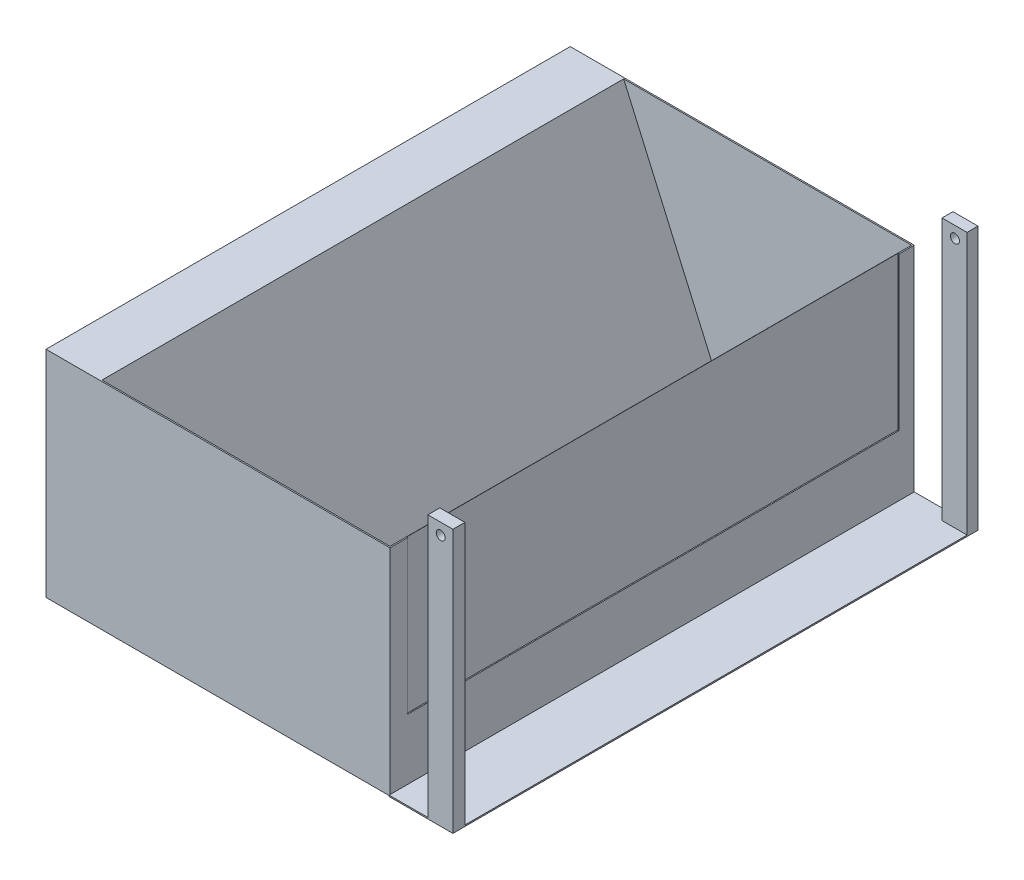
ISO-10303-21;
HEADER;
FILE_DESCRIPTION(('STEP AP214'),'2;1');
FILE_NAME('part.step','',(''),(''),'','','');
FILE_SCHEMA(('AUTOMOTIVE_DESIGN { 1 0 10303 214 1 1 1 1 }'));
ENDSEC;
DATA;
#1=APPLICATION_CONTEXT('core data for automotive mechanical design processes');
#2=APPLICATION_PROTOCOL_DEFINITION('international standard','automotive_design',2000,#1);
#3=PRODUCT_CONTEXT('',#1,'mechanical');
#4=PRODUCT('Part','Part','',(#3));
#5=PRODUCT_RELATED_PRODUCT_CATEGORY('part','',(#4));
#6=PRODUCT_DEFINITION_FORMATION('','',#4);
#7=PRODUCT_DEFINITION_CONTEXT('part definition',#1,'design');
#8=PRODUCT_DEFINITION('design','',#6,#7);
#9=PRODUCT_DEFINITION_SHAPE('','',#8);
#10=(LENGTH_UNIT() NAMED_UNIT(*) SI_UNIT(.MILLI.,.METRE.));
#11=(NAMED_UNIT(*) PLANE_ANGLE_UNIT() SI_UNIT($,.RADIAN.));
#12=(NAMED_UNIT(*) SI_UNIT($,.STERADIAN.) SOLID_ANGLE_UNIT());
#13=UNCERTAINTY_MEASURE_WITH_UNIT(LENGTH_MEASURE(1.E-05),#10,'distance_accuracy_value','');
#14=(GEOMETRIC_REPRESENTATION_CONTEXT(3) GLOBAL_UNCERTAINTY_ASSIGNED_CONTEXT((#13)) GLOBAL_UNIT_ASSIGNED_CONTEXT((#10,
#11,#12)) REPRESENTATION_CONTEXT('',''));
#15=CARTESIAN_POINT('',(0.,0.,0.));
#16=DIRECTION('',(0.,0.,1.));
#17=DIRECTION('',(1.,0.,0.));
#18=AXIS2_PLACEMENT_3D('',#15,#16,#17);
#19=CARTESIAN_POINT('',(0.,3.00010033,0.));
#20=DIRECTION('',(0.,-1.,0.));
#21=DIRECTION('',(0.,0.,-1.));
#22=AXIS2_PLACEMENT_3D('',#19,#20,#21);
#23=PLANE('',#22);
#24=DIRECTION('',(-1.,0.,0.));
#25=VECTOR('',#24,1.);
#26=CARTESIAN_POINT('',(165.415258105816,3.00010033,0.));
#27=LINE('',#26,#25);
#28=CARTESIAN_POINT('',(165.415258105816,3.00010033,0.));
#29=VERTEX_POINT('',#28);
#30=CARTESIAN_POINT('',(107.186289926717,3.00010033,0.));
#31=VERTEX_POINT('',#30);
#32=EDGE_CURVE('E138',#29,#31,#27,.T.);
#33=ORIENTED_EDGE('',*,*,#32,.F.);
#34=DIRECTION('',(0.,0.,1.));
#35=VECTOR('',#34,1.);
#36=CARTESIAN_POINT('',(165.415258105816,3.00010033,-1193.38210272873));
#37=LINE('',#36,#35);
#38=CARTESIAN_POINT('',(165.415258105816,3.00010033,-1167.98210272873));
#39=VERTEX_POINT('',#38);
#40=EDGE_CURVE('E150',#39,#29,#37,.T.);
#41=ORIENTED_EDGE('',*,*,#40,.F.);
#42=DIRECTION('',(1.,0.,0.));
#43=VECTOR('',#42,1.);
#44=CARTESIAN_POINT('',(107.186289926717,3.00010033,-1167.98210272873));
#45=LINE('',#44,#43);
#46=CARTESIAN_POINT('',(107.186289926717,3.00010033,-1167.98210272873));
#47=VERTEX_POINT('',#46);
#48=EDGE_CURVE('E66',#47,#39,#45,.T.);
#49=ORIENTED_EDGE('',*,*,#48,.F.);
#50=DIRECTION('',(0.,0.,1.));
#51=VECTOR('',#50,1.);
#52=CARTESIAN_POINT('',(107.186289926717,3.00010033,-1193.38210272873));
#53=LINE('',#52,#51);
#54=CARTESIAN_POINT('',(107.186289926717,3.00010033,-1193.38210272873));
#55=VERTEX_POINT('',#54);
#56=EDGE_CURVE('E71',#55,#47,#53,.T.);
#57=ORIENTED_EDGE('',*,*,#56,.F.);
#58=DIRECTION('',(1.,0.,0.));
#59=VECTOR('',#58,1.);
#60=CARTESIAN_POINT('',(17.0836237800826,3.00010033,-1193.38210272873));
#61=LINE('',#60,#59);
#62=CARTESIAN_POINT('',(17.0836237800826,3.00010033,-1193.38210272873));
#63=VERTEX_POINT('',#62);
#64=EDGE_CURVE('E154',#63,#55,#61,.T.);
#65=ORIENTED_EDGE('',*,*,#64,.F.);
#66=DIRECTION('',(0.,0.,1.));
#67=VECTOR('',#66,1.);
#68=CARTESIAN_POINT('',(17.0836237800826,3.00010033,-1193.38210272873));
#69=LINE('',#68,#67);
#70=CARTESIAN_POINT('',(17.0836237800826,3.00010033,27.840540907166));
#71=VERTEX_POINT('',#70);
#72=EDGE_CURVE('E149',#63,#71,#69,.T.);
#73=ORIENTED_EDGE('',*,*,#72,.T.);
#74=DIRECTION('',(1.,0.,0.));
#75=VECTOR('',#74,1.);
#76=CARTESIAN_POINT('',(17.0836237800826,3.00010033,27.840540907166));
#77=LINE('',#76,#75);
#78=CARTESIAN_POINT('',(107.186289926717,3.00010033,27.840540907166));
#79=VERTEX_POINT('',#78);
#80=EDGE_CURVE('E143',#71,#79,#77,.T.);
#81=ORIENTED_EDGE('',*,*,#80,.T.);
#82=DIRECTION('',(0.,0.,1.));
#83=VECTOR('',#82,1.);
#84=CARTESIAN_POINT('',(107.186289926717,3.00010033,27.840540907166));
#85=LINE('',#84,#83);
#86=EDGE_CURVE('E128',#31,#79,#85,.T.);
#87=ORIENTED_EDGE('',*,*,#86,.F.);
#88=EDGE_LOOP('',(#33,#41,#49,#57,#65,#73,#81,#87));
#89=FACE_BOUND('',#88,.T.);
#90=ADVANCED_FACE('F49',(#89),#23,.F.);
#91=CARTESIAN_POINT('',(17.0836237800826,-0.0479999999999999,27.840540907166));
#92=DIRECTION('',(0.,0.,1.));
#93=DIRECTION('',(1.,0.,0.));
#94=AXIS2_PLACEMENT_3D('',#91,#92,#93);
#95=PLANE('',#94);
#96=CARTESIAN_POINT('',(137.096355471617,586.215569874302,27.840540907166));
#97=DIRECTION('',(0.,0.,1.));
#98=DIRECTION('',(1.,0.,0.));
#99=AXIS2_PLACEMENT_3D('',#96,#97,#98);
#100=CIRCLE('',#99,10.4501468390423);
#101=CARTESIAN_POINT('',(147.546502310659,586.215569874302,27.840540907166));
#102=VERTEX_POINT('',#101);
#103=EDGE_CURVE('E401',#102,#102,#100,.T.);
#104=ORIENTED_EDGE('',*,*,#103,.F.);
#105=EDGE_LOOP('',(#104));
#106=FACE_BOUND('',#105,.T.);
#107=DIRECTION('',(0.,1.,0.));
#108=VECTOR('',#107,1.);
#109=CARTESIAN_POINT('',(165.415258105816,-0.0479999999999999,27.840540907166));
#110=LINE('',#109,#108);
#111=CARTESIAN_POINT('',(165.415258105816,-0.0479999999999999,27.840540907166));
#112=VERTEX_POINT('',#111);
#113=CARTESIAN_POINT('',(165.415258105816,612.60010033,27.840540907166));
#114=VERTEX_POINT('',#113);
#115=EDGE_CURVE('E171',#112,#114,#110,.T.);
#116=ORIENTED_EDGE('',*,*,#115,.T.);
#117=DIRECTION('',(1.,0.,0.));
#118=VECTOR('',#117,1.);
#119=CARTESIAN_POINT('',(165.415258105816,612.60010033,27.840540907166));
#120=LINE('',#119,#118);
#121=CARTESIAN_POINT('',(107.186289926717,612.60010033,27.840540907166));
#122=VERTEX_POINT('',#121);
#123=EDGE_CURVE('E145',#122,#114,#120,.T.);
#124=ORIENTED_EDGE('',*,*,#123,.F.);
#125=DIRECTION('',(0.,-1.,0.));
#126=VECTOR('',#125,1.);
#127=CARTESIAN_POINT('',(107.186289926717,612.60010033,27.840540907166));
#128=LINE('',#127,#126);
#129=EDGE_CURVE('E132',#122,#79,#128,.T.);
#130=ORIENTED_EDGE('',*,*,#129,.T.);
#131=ORIENTED_EDGE('',*,*,#80,.F.);
#132=DIRECTION('',(0.,1.,0.));
#133=VECTOR('',#132,1.);
#134=CARTESIAN_POINT('',(17.0836237800826,-0.0479999999999999,27.840540907166));
#135=LINE('',#134,#133);
#136=CARTESIAN_POINT('',(17.0836237800826,-0.0479999999999999,27.840540907166));
#137=VERTEX_POINT('',#136);
#138=EDGE_CURVE('E12',#137,#71,#135,.T.);
#139=ORIENTED_EDGE('',*,*,#138,.F.);
#140=DIRECTION('',(1.,0.,0.));
#141=VECTOR('',#140,1.);
#142=CARTESIAN_POINT('',(17.0836237800826,-0.0479999999999999,27.840540907166));
#143=LINE('',#142,#141);
#144=EDGE_CURVE('E162',#137,#112,#143,.T.);
#145=ORIENTED_EDGE('',*,*,#144,.T.);
#146=EDGE_LOOP('',(#116,#124,#130,#131,#139,#145));
#147=FACE_BOUND('',#146,.T.);
#148=ADVANCED_FACE('F51',(#106,#147),#95,.T.);
#149=CARTESIAN_POINT('',(17.0836237800826,-0.0479999999999999,-1193.38210272873));
#150=DIRECTION('',(-1.,0.,0.));
#151=DIRECTION('',(0.,0.,1.));
#152=AXIS2_PLACEMENT_3D('',#149,#150,#151);
#153=PLANE('',#152);
#154=ORIENTED_EDGE('',*,*,#138,.T.);
#155=ORIENTED_EDGE('',*,*,#72,.F.);
#156=DIRECTION('',(0.,1.,0.));
#157=VECTOR('',#156,1.);
#158=CARTESIAN_POINT('',(17.0836237800826,-0.0479999999999999,-1193.38210272873));
#159=LINE('',#158,#157);
#160=CARTESIAN_POINT('',(17.0836237800826,-0.0479999999999999,-1193.38210272873));
#161=VERTEX_POINT('',#160);
#162=EDGE_CURVE('E58',#161,#63,#159,.T.);
#163=ORIENTED_EDGE('',*,*,#162,.F.);
#164=DIRECTION('',(0.,0.,1.));
#165=VECTOR('',#164,1.);
#166=CARTESIAN_POINT('',(17.0836237800826,-0.0479999999999999,-1193.38210272873));
#167=LINE('',#166,#165);
#168=EDGE_CURVE('E169',#161,#137,#167,.T.);
#169=ORIENTED_EDGE('',*,*,#168,.T.);
#170=EDGE_LOOP('',(#154,#155,#163,#169));
#171=FACE_BOUND('',#170,.T.);
#172=ADVANCED_FACE('F224',(#171),#153,.T.);
#173=CARTESIAN_POINT('',(17.0836237800826,-0.0479999999999999,-1193.38210272873));
#174=DIRECTION('',(0.,0.,1.));
#175=DIRECTION('',(1.,0.,0.));
#176=AXIS2_PLACEMENT_3D('',#173,#174,#175);
#177=PLANE('',#176);
#178=ORIENTED_EDGE('',*,*,#162,.T.);
#179=ORIENTED_EDGE('',*,*,#64,.T.);
#180=DIRECTION('',(0.,-1.,0.));
#181=VECTOR('',#180,1.);
#182=CARTESIAN_POINT('',(107.186289926717,612.60010033,-1193.38210272873));
#183=LINE('',#182,#181);
#184=CARTESIAN_POINT('',(107.186289926717,612.60010033,-1193.38210272873));
#185=VERTEX_POINT('',#184);
#186=EDGE_CURVE('E203',#185,#55,#183,.T.);
#187=ORIENTED_EDGE('',*,*,#186,.F.);
#188=DIRECTION('',(-1.,0.,0.));
#189=VECTOR('',#188,1.);
#190=CARTESIAN_POINT('',(107.186289926717,612.60010033,-1193.38210272873));
#191=LINE('',#190,#189);
#192=CARTESIAN_POINT('',(165.415258105816,612.60010033,-1193.38210272873));
#193=VERTEX_POINT('',#192);
#194=EDGE_CURVE('E201',#193,#185,#191,.T.);
#195=ORIENTED_EDGE('',*,*,#194,.F.);
#196=DIRECTION('',(0.,1.,0.));
#197=VECTOR('',#196,1.);
#198=CARTESIAN_POINT('',(165.415258105816,-0.0479999999999999,-1193.38210272873));
#199=LINE('',#198,#197);
#200=CARTESIAN_POINT('',(165.415258105816,-0.0479999999999999,-1193.38210272873));
#201=VERTEX_POINT('',#200);
#202=EDGE_CURVE('E174',#201,#193,#199,.T.);
#203=ORIENTED_EDGE('',*,*,#202,.F.);
#204=DIRECTION('',(1.,0.,0.));
#205=VECTOR('',#204,1.);
#206=CARTESIAN_POINT('',(17.0836237800826,-0.0479999999999999,-1193.38210272873));
#207=LINE('',#206,#205);
#208=EDGE_CURVE('E167',#161,#201,#207,.T.);
#209=ORIENTED_EDGE('',*,*,#208,.F.);
#210=EDGE_LOOP('',(#178,#179,#187,#195,#203,#209));
#211=FACE_BOUND('',#210,.T.);
#212=ADVANCED_FACE('F219',(#211),#177,.F.);
#213=CARTESIAN_POINT('',(165.415258105816,-0.0479999999999999,-1193.38210272873));
#214=DIRECTION('',(-1.,0.,0.));
#215=DIRECTION('',(0.,0.,1.));
#216=AXIS2_PLACEMENT_3D('',#213,#214,#215);
#217=PLANE('',#216);
#218=ORIENTED_EDGE('',*,*,#202,.T.);
#219=DIRECTION('',(0.,0.,-1.));
#220=VECTOR('',#219,1.);
#221=CARTESIAN_POINT('',(165.415258105816,612.60010033,-1193.38210272873));
#222=LINE('',#221,#220);
#223=CARTESIAN_POINT('',(165.415258105816,612.60010033,-1167.98210272873));
#224=VERTEX_POINT('',#223);
#225=EDGE_CURVE('E198',#224,#193,#222,.T.);
#226=ORIENTED_EDGE('',*,*,#225,.F.);
#227=DIRECTION('',(0.,-1.,0.));
#228=VECTOR('',#227,1.);
#229=CARTESIAN_POINT('',(165.415258105816,612.60010033,-1167.98210272873));
#230=LINE('',#229,#228);
#231=EDGE_CURVE('E156',#224,#39,#230,.T.);
#232=ORIENTED_EDGE('',*,*,#231,.T.);
#233=ORIENTED_EDGE('',*,*,#40,.T.);
#234=DIRECTION('',(0.,-1.,0.));
#235=VECTOR('',#234,1.);
#236=CARTESIAN_POINT('',(165.415258105816,612.60010033,0.));
#237=LINE('',#236,#235);
#238=CARTESIAN_POINT('',(165.415258105816,612.60010033,0.));
#239=VERTEX_POINT('',#238);
#240=EDGE_CURVE('E187',#239,#29,#237,.T.);
#241=ORIENTED_EDGE('',*,*,#240,.F.);
#242=DIRECTION('',(0.,0.,-1.));
#243=VECTOR('',#242,1.);
#244=CARTESIAN_POINT('',(165.415258105816,612.60010033,27.840540907166));
#245=LINE('',#244,#243);
#246=EDGE_CURVE('E139',#114,#239,#245,.T.);
#247=ORIENTED_EDGE('',*,*,#246,.F.);
#248=ORIENTED_EDGE('',*,*,#115,.F.);
#249=DIRECTION('',(0.,0.,1.));
#250=VECTOR('',#249,1.);
#251=CARTESIAN_POINT('',(165.415258105816,-0.0479999999999999,-1193.38210272873));
#252=LINE('',#251,#250);
#253=EDGE_CURVE('E165',#201,#112,#252,.T.);
#254=ORIENTED_EDGE('',*,*,#253,.F.);
#255=EDGE_LOOP('',(#218,#226,#232,#233,#241,#247,#248,#254));
#256=FACE_BOUND('',#255,.T.);
#257=ADVANCED_FACE('F186',(#256),#217,.F.);
#258=CARTESIAN_POINT('',(0.,-0.0479999999999999,0.));
#259=DIRECTION('',(0.,-1.,0.));
#260=DIRECTION('',(0.,0.,-1.));
#261=AXIS2_PLACEMENT_3D('',#258,#259,#260);
#262=PLANE('',#261);
#263=ORIENTED_EDGE('',*,*,#144,.F.);
#264=ORIENTED_EDGE('',*,*,#168,.F.);
#265=ORIENTED_EDGE('',*,*,#208,.T.);
#266=ORIENTED_EDGE('',*,*,#253,.T.);
#267=EDGE_LOOP('',(#263,#264,#265,#266));
#268=FACE_BOUND('',#267,.T.);
#269=ADVANCED_FACE('F226',(#268),#262,.T.);
#270=CARTESIAN_POINT('',(107.186289926717,612.60010033,-1193.38210272873));
#271=DIRECTION('',(1.,0.,0.));
#272=DIRECTION('',(0.,0.,-1.));
#273=AXIS2_PLACEMENT_3D('',#270,#271,#272);
#274=PLANE('',#273);
#275=ORIENTED_EDGE('',*,*,#56,.T.);
#276=DIRECTION('',(0.,-1.,0.));
#277=VECTOR('',#276,1.);
#278=CARTESIAN_POINT('',(107.186289926717,612.60010033,-1167.98210272873));
#279=LINE('',#278,#277);
#280=CARTESIAN_POINT('',(107.186289926717,612.60010033,-1167.98210272873));
#281=VERTEX_POINT('',#280);
#282=EDGE_CURVE('E151',#281,#47,#279,.T.);
#283=ORIENTED_EDGE('',*,*,#282,.F.);
#284=DIRECTION('',(0.,0.,1.));
#285=VECTOR('',#284,1.);
#286=CARTESIAN_POINT('',(107.186289926717,612.60010033,-1193.38210272873));
#287=LINE('',#286,#285);
#288=EDGE_CURVE('E193',#185,#281,#287,.T.);
#289=ORIENTED_EDGE('',*,*,#288,.F.);
#290=ORIENTED_EDGE('',*,*,#186,.T.);
#291=EDGE_LOOP('',(#275,#283,#289,#290));
#292=FACE_BOUND('',#291,.T.);
#293=ADVANCED_FACE('F215',(#292),#274,.F.);
#294=CARTESIAN_POINT('',(107.186289926717,612.60010033,-1167.98210272873));
#295=DIRECTION('',(0.,0.,-1.));
#296=DIRECTION('',(-1.,0.,0.));
#297=AXIS2_PLACEMENT_3D('',#294,#295,#296);
#298=PLANE('',#297);
#299=CARTESIAN_POINT('',(137.096355471617,586.215569874302,-1167.98210272873));
#300=DIRECTION('',(0.,0.,-1.));
#301=DIRECTION('',(-1.,0.,0.));
#302=AXIS2_PLACEMENT_3D('',#299,#300,#301);
#303=CIRCLE('',#302,10.4501468390423);
#304=CARTESIAN_POINT('',(147.546502310659,586.215569874302,-1167.98210272873));
#305=VERTEX_POINT('',#304);
#306=EDGE_CURVE('E404',#305,#305,#303,.T.);
#307=ORIENTED_EDGE('',*,*,#306,.T.);
#308=EDGE_LOOP('',(#307));
#309=FACE_BOUND('',#308,.T.);
#310=ORIENTED_EDGE('',*,*,#48,.T.);
#311=ORIENTED_EDGE('',*,*,#231,.F.);
#312=DIRECTION('',(1.,0.,0.));
#313=VECTOR('',#312,1.);
#314=CARTESIAN_POINT('',(107.186289926717,612.60010033,-1167.98210272873));
#315=LINE('',#314,#313);
#316=EDGE_CURVE('E196',#281,#224,#315,.T.);
#317=ORIENTED_EDGE('',*,*,#316,.F.);
#318=ORIENTED_EDGE('',*,*,#282,.T.);
#319=EDGE_LOOP('',(#310,#311,#317,#318));
#320=FACE_BOUND('',#319,.T.);
#321=ADVANCED_FACE('F211',(#309,#320),#298,.F.);
#322=CARTESIAN_POINT('',(0.,612.60010033,0.));
#323=DIRECTION('',(0.,1.,0.));
#324=DIRECTION('',(0.,0.,1.));
#325=AXIS2_PLACEMENT_3D('',#322,#323,#324);
#326=PLANE('',#325);
#327=ORIENTED_EDGE('',*,*,#288,.T.);
#328=ORIENTED_EDGE('',*,*,#316,.T.);
#329=ORIENTED_EDGE('',*,*,#225,.T.);
#330=ORIENTED_EDGE('',*,*,#194,.T.);
#331=EDGE_LOOP('',(#327,#328,#329,#330));
#332=FACE_BOUND('',#331,.T.);
#333=ADVANCED_FACE('F228',(#332),#326,.T.);
#334=CARTESIAN_POINT('',(165.415258105816,612.60010033,0.));
#335=DIRECTION('',(0.,0.,1.));
#336=DIRECTION('',(1.,0.,0.));
#337=AXIS2_PLACEMENT_3D('',#334,#335,#336);
#338=PLANE('',#337);
#339=CARTESIAN_POINT('',(137.096355471617,586.215569874302,0.));
#340=DIRECTION('',(0.,0.,1.));
#341=DIRECTION('',(1.,0.,0.));
#342=AXIS2_PLACEMENT_3D('',#339,#340,#341);
#343=CIRCLE('',#342,10.4501468390423);
#344=CARTESIAN_POINT('',(147.546502310659,586.215569874302,0.));
#345=VERTEX_POINT('',#344);
#346=EDGE_CURVE('E53',#345,#345,#343,.T.);
#347=ORIENTED_EDGE('',*,*,#346,.T.);
#348=EDGE_LOOP('',(#347));
#349=FACE_BOUND('',#348,.T.);
#350=ORIENTED_EDGE('',*,*,#32,.T.);
#351=DIRECTION('',(0.,-1.,0.));
#352=VECTOR('',#351,1.);
#353=CARTESIAN_POINT('',(107.186289926717,612.60010033,0.));
#354=LINE('',#353,#352);
#355=CARTESIAN_POINT('',(107.186289926717,612.60010033,0.));
#356=VERTEX_POINT('',#355);
#357=EDGE_CURVE('E135',#356,#31,#354,.T.);
#358=ORIENTED_EDGE('',*,*,#357,.F.);
#359=DIRECTION('',(-1.,0.,0.));
#360=VECTOR('',#359,1.);
#361=CARTESIAN_POINT('',(165.415258105816,612.60010033,0.));
#362=LINE('',#361,#360);
#363=EDGE_CURVE('E188',#239,#356,#362,.T.);
#364=ORIENTED_EDGE('',*,*,#363,.F.);
#365=ORIENTED_EDGE('',*,*,#240,.T.);
#366=EDGE_LOOP('',(#350,#358,#364,#365));
#367=FACE_BOUND('',#366,.T.);
#368=ADVANCED_FACE('F230',(#349,#367),#338,.F.);
#369=CARTESIAN_POINT('',(107.186289926717,612.60010033,27.840540907166));
#370=DIRECTION('',(1.,0.,0.));
#371=DIRECTION('',(0.,0.,-1.));
#372=AXIS2_PLACEMENT_3D('',#369,#370,#371);
#373=PLANE('',#372);
#374=ORIENTED_EDGE('',*,*,#86,.T.);
#375=ORIENTED_EDGE('',*,*,#129,.F.);
#376=DIRECTION('',(0.,0.,1.));
#377=VECTOR('',#376,1.);
#378=CARTESIAN_POINT('',(107.186289926717,612.60010033,27.840540907166));
#379=LINE('',#378,#377);
#380=EDGE_CURVE('E184',#356,#122,#379,.T.);
#381=ORIENTED_EDGE('',*,*,#380,.F.);
#382=ORIENTED_EDGE('',*,*,#357,.T.);
#383=EDGE_LOOP('',(#374,#375,#381,#382));
#384=FACE_BOUND('',#383,.T.);
#385=ADVANCED_FACE('F130',(#384),#373,.F.);
#386=CARTESIAN_POINT('',(0.,612.60010033,0.));
#387=DIRECTION('',(0.,1.,0.));
#388=DIRECTION('',(0.,0.,1.));
#389=AXIS2_PLACEMENT_3D('',#386,#387,#388);
#390=PLANE('',#389);
#391=ORIENTED_EDGE('',*,*,#246,.T.);
#392=ORIENTED_EDGE('',*,*,#363,.T.);
#393=ORIENTED_EDGE('',*,*,#380,.T.);
#394=ORIENTED_EDGE('',*,*,#123,.T.);
#395=EDGE_LOOP('',(#391,#392,#393,#394));
#396=FACE_BOUND('',#395,.T.);
#397=ADVANCED_FACE('F182',(#396),#390,.T.);
#398=CARTESIAN_POINT('',(137.096355471617,586.215569874302,-1191.35945909283));
#399=DIRECTION('',(0.,0.,1.));
#400=DIRECTION('',(1.,0.,0.));
#401=AXIS2_PLACEMENT_3D('',#398,#399,#400);
#402=CYLINDRICAL_SURFACE('',#401,10.4501468390423);
#403=CARTESIAN_POINT('',(147.546502310659,586.215569874302,27.840540907166));
#404=CARTESIAN_POINT('',(147.546502310659,586.215569874302,27.5505352727164));
#405=CARTESIAN_POINT('',(147.546502310659,586.215569874302,27.2605296382668));
#406=CARTESIAN_POINT('',(147.546502310659,586.215569874302,26.6805183693675));
#407=CARTESIAN_POINT('',(147.546502310659,586.215569874302,26.3905127349178));
#408=CARTESIAN_POINT('',(147.546502310659,586.215569874302,25.8105014660185));
#409=CARTESIAN_POINT('',(147.546502310659,586.215569874302,25.5204958315688));
#410=CARTESIAN_POINT('',(147.546502310659,586.215569874302,24.9404845626696));
#411=CARTESIAN_POINT('',(147.546502310659,586.215569874302,24.65047892822));
#412=CARTESIAN_POINT('',(147.546502310659,586.215569874302,24.0704676593206));
#413=CARTESIAN_POINT('',(147.546502310659,586.215569874302,23.7804620248709));
#414=CARTESIAN_POINT('',(147.546502310659,586.215569874302,23.2004507559716));
#415=CARTESIAN_POINT('',(147.546502310659,586.215569874302,22.910445121522));
#416=CARTESIAN_POINT('',(147.546502310659,586.215569874302,22.3304338526228));
#417=CARTESIAN_POINT('',(147.546502310659,586.215569874302,22.0404282181731));
#418=CARTESIAN_POINT('',(147.546502310659,586.215569874302,21.4604169492739));
#419=CARTESIAN_POINT('',(147.546502310659,586.215569874302,21.1704113148243));
#420=CARTESIAN_POINT('',(147.546502310659,586.215569874302,20.5904000459249));
#421=CARTESIAN_POINT('',(147.546502310659,586.215569874302,20.3003944114752));
#422=CARTESIAN_POINT('',(147.546502310659,586.215569874302,19.7203831425759));
#423=CARTESIAN_POINT('',(147.546502310659,586.215569874302,19.4303775081263));
#424=CARTESIAN_POINT('',(147.546502310659,586.215569874302,18.8503662392271));
#425=CARTESIAN_POINT('',(147.546502310659,586.215569874302,18.5603606047774));
#426=CARTESIAN_POINT('',(147.546502310659,586.215569874302,17.9803493358781));
#427=CARTESIAN_POINT('',(147.546502310659,586.215569874302,17.6903437014284));
#428=CARTESIAN_POINT('',(147.546502310659,586.215569874302,17.1103324325291));
#429=CARTESIAN_POINT('',(147.546502310659,586.215569874302,16.8203267980795));
#430=CARTESIAN_POINT('',(147.546502310659,586.215569874302,16.2403155291802));
#431=CARTESIAN_POINT('',(147.546502310659,586.215569874302,15.9503098947306));
#432=CARTESIAN_POINT('',(147.546502310659,586.215569874302,15.3702986258313));
#433=CARTESIAN_POINT('',(147.546502310659,586.215569874302,15.0802929913816));
#434=CARTESIAN_POINT('',(147.546502310659,586.215569874302,14.5002817224823));
#435=CARTESIAN_POINT('',(147.546502310659,586.215569874302,14.2102760880326));
#436=CARTESIAN_POINT('',(147.546502310659,586.215569874302,13.6302648191334));
#437=CARTESIAN_POINT('',(147.546502310659,586.215569874302,13.3402591846838));
#438=CARTESIAN_POINT('',(147.546502310659,586.215569874302,12.7602479157845));
#439=CARTESIAN_POINT('',(147.546502310659,586.215569874302,12.4702422813348));
#440=CARTESIAN_POINT('',(147.546502310659,586.215569874302,11.8902310124354));
#441=CARTESIAN_POINT('',(147.546502310659,586.215569874302,11.6002253779858));
#442=CARTESIAN_POINT('',(147.546502310659,586.215569874302,11.0202141090866));
#443=CARTESIAN_POINT('',(147.546502310659,586.215569874302,10.7302084746369));
#444=CARTESIAN_POINT('',(147.546502310659,586.215569874302,10.1501972057376));
#445=CARTESIAN_POINT('',(147.546502310659,586.215569874302,9.86019157128792));
#446=CARTESIAN_POINT('',(147.546502310659,586.215569874302,9.2801803023886));
#447=CARTESIAN_POINT('',(147.546502310659,586.215569874302,8.99017466793898));
#448=CARTESIAN_POINT('',(147.546502310659,586.215569874302,8.41016339903974));
#449=CARTESIAN_POINT('',(147.546502310659,586.215569874302,8.12015776459011));
#450=CARTESIAN_POINT('',(147.546502310659,586.215569874302,7.54014649569079));
#451=CARTESIAN_POINT('',(147.546502310659,586.215569874302,7.25014086124109));
#452=CARTESIAN_POINT('',(147.546502310659,586.215569874302,6.67012959234177));
#453=CARTESIAN_POINT('',(147.546502310659,586.215569874302,6.38012395789215));
#454=CARTESIAN_POINT('',(147.546502310659,586.215569874302,5.8001126889929));
#455=CARTESIAN_POINT('',(147.546502310659,586.215569874302,5.51010705454328));
#456=CARTESIAN_POINT('',(147.546502310659,586.215569874302,4.93009578564404));
#457=CARTESIAN_POINT('',(147.546502310659,586.215569874302,4.64009015119441));
#458=CARTESIAN_POINT('',(147.546502310659,586.215569874302,4.06007888229509));
#459=CARTESIAN_POINT('',(147.546502310659,586.215569874302,3.7700732478454));
#460=CARTESIAN_POINT('',(147.546502310659,586.215569874302,3.19006197894608));
#461=CARTESIAN_POINT('',(147.546502310659,586.215569874302,2.90005634449645));
#462=CARTESIAN_POINT('',(147.546502310659,586.215569874302,2.32004507559721));
#463=CARTESIAN_POINT('',(147.546502310659,586.215569874302,2.03003944114758));
#464=CARTESIAN_POINT('',(147.546502310659,586.215569874302,1.45002817224826));
#465=CARTESIAN_POINT('',(147.546502310659,586.215569874302,1.16002253779857));
#466=CARTESIAN_POINT('',(147.546502310659,586.215569874302,0.580011268899246));
#467=CARTESIAN_POINT('',(147.546502310659,586.215569874302,0.290005634449623));
#468=CARTESIAN_POINT('',(147.546502310659,586.215569874302,0.));
#469=B_SPLINE_CURVE_WITH_KNOTS('',3,(#403,#404,#405,#406,#407,#408,#409,#410,#411,#412,#413,
#414,#415,#416,#417,#418,#419,#420,#421,#422,#423,#424,#425,#426,#427,#428,#429,#430,#431,#432,
#433,#434,#435,#436,#437,#438,#439,#440,#441,#442,#443,#444,#445,#446,#447,#448,#449,#450,#451,
#452,#453,#454,#455,#456,#457,#458,#459,#460,#461,#462,#463,#464,#465,#466,#467,#468),
.UNSPECIFIED.,.F.,.F.,(4,2,2,2,2,2,2,2,2,2,2,2,2,2,2,2,2,2,2,2,2,2,2,2,2,2,2,2,2,2,2,2,4),(0.,
0.870016903348869,1.74003380669796,2.61005071004683,3.4800676133957,4.35008451674479,
5.22010142009366,6.09011832344253,6.9601352267914,7.83015213014049,8.70016903348936,
9.57018593683823,10.4402028401873,11.3102197435362,12.1802366468851,13.0502535502341,
13.920270453583,14.7902873569319,15.660304260281,16.5303211636298,17.4003380669787,
18.2703549703278,19.1403718736767,20.0103887770255,20.8804056803746,21.7504225837235,
22.6204394870724,23.4904563904212,24.3604732937703,25.2304901971192,26.1005071004681,
26.9705240038172,27.840540907166),.UNSPECIFIED.);
#470=EDGE_CURVE('BSEAM293',#102,#345,#469,.T.);
#471=ORIENTED_EDGE('',*,*,#103,.T.);
#472=ORIENTED_EDGE('',*,*,#346,.F.);
#473=ORIENTED_EDGE('',*,*,#470,.T.);
#474=ORIENTED_EDGE('',*,*,#470,.F.);
#475=EDGE_LOOP('',(#471,#473,#472,#474));
#476=FACE_BOUND('',#475,.T.);
#477=ADVANCED_FACE('F293',(#476),#402,.F.);
#478=CARTESIAN_POINT('',(137.096355471617,586.215569874302,-1191.35945909283));
#479=DIRECTION('',(0.,0.,1.));
#480=DIRECTION('',(1.,0.,0.));
#481=AXIS2_PLACEMENT_3D('',#478,#479,#480);
#482=CIRCLE('',#481,10.4501468390423);
#483=CARTESIAN_POINT('',(147.546502310659,586.215569874302,-1191.35945909283));
#484=VERTEX_POINT('',#483);
#485=EDGE_CURVE('E400',#484,#484,#482,.T.);
#486=CARTESIAN_POINT('',(147.546502310659,586.215569874302,-1191.35945909283));
#487=CARTESIAN_POINT('',(147.546502310659,586.215569874302,-1191.11594496404));
#488=CARTESIAN_POINT('',(147.546502310659,586.215569874302,-1190.87243083525));
#489=CARTESIAN_POINT('',(147.546502310659,586.215569874302,-1190.38540257766));
#490=CARTESIAN_POINT('',(147.546502310659,586.215569874302,-1190.14188844887));
#491=CARTESIAN_POINT('',(147.546502310659,586.215569874302,-1189.65486019129));
#492=CARTESIAN_POINT('',(147.546502310659,586.215569874302,-1189.41134606249));
#493=CARTESIAN_POINT('',(147.546502310659,586.215569874302,-1188.92431780491));
#494=CARTESIAN_POINT('',(147.546502310659,586.215569874302,-1188.68080367611));
#495=CARTESIAN_POINT('',(147.546502310659,586.215569874302,-1188.19377541853));
#496=CARTESIAN_POINT('',(147.546502310659,586.215569874302,-1187.95026128974));
#497=CARTESIAN_POINT('',(147.546502310659,586.215569874302,-1187.46323303215));
#498=CARTESIAN_POINT('',(147.546502310659,586.215569874302,-1187.21971890336));
#499=CARTESIAN_POINT('',(147.546502310659,586.215569874302,-1186.73269064577));
#500=CARTESIAN_POINT('',(147.546502310659,586.215569874302,-1186.48917651698));
#501=CARTESIAN_POINT('',(147.546502310659,586.215569874302,-1186.00214825939));
#502=CARTESIAN_POINT('',(147.546502310659,586.215569874302,-1185.7586341306));
#503=CARTESIAN_POINT('',(147.546502310659,586.215569874302,-1185.27160587302));
#504=CARTESIAN_POINT('',(147.546502310659,586.215569874302,-1185.02809174422));
#505=CARTESIAN_POINT('',(147.546502310659,586.215569874302,-1184.54106348664));
#506=CARTESIAN_POINT('',(147.546502310659,586.215569874302,-1184.29754935784));
#507=CARTESIAN_POINT('',(147.546502310659,586.215569874302,-1183.81052110026));
#508=CARTESIAN_POINT('',(147.546502310659,586.215569874302,-1183.56700697147));
#509=CARTESIAN_POINT('',(147.546502310659,586.215569874302,-1183.07997871388));
#510=CARTESIAN_POINT('',(147.546502310659,586.215569874302,-1182.83646458509));
#511=CARTESIAN_POINT('',(147.546502310659,586.215569874302,-1182.3494363275));
#512=CARTESIAN_POINT('',(147.546502310659,586.215569874302,-1182.10592219871));
#513=CARTESIAN_POINT('',(147.546502310659,586.215569874302,-1181.61889394112));
#514=CARTESIAN_POINT('',(147.546502310659,586.215569874302,-1181.37537981233));
#515=CARTESIAN_POINT('',(147.546502310659,586.215569874302,-1180.88835155475));
#516=CARTESIAN_POINT('',(147.546502310659,586.215569874302,-1180.64483742595));
#517=CARTESIAN_POINT('',(147.546502310659,586.215569874302,-1180.15780916837));
#518=CARTESIAN_POINT('',(147.546502310659,586.215569874302,-1179.91429503958));
#519=CARTESIAN_POINT('',(147.546502310659,586.215569874302,-1179.42726678199));
#520=CARTESIAN_POINT('',(147.546502310659,586.215569874302,-1179.1837526532));
#521=CARTESIAN_POINT('',(147.546502310659,586.215569874302,-1178.69672439561));
#522=CARTESIAN_POINT('',(147.546502310659,586.215569874302,-1178.45321026682));
#523=CARTESIAN_POINT('',(147.546502310659,586.215569874302,-1177.96618200923));
#524=CARTESIAN_POINT('',(147.546502310659,586.215569874302,-1177.72266788044));
#525=CARTESIAN_POINT('',(147.546502310659,586.215569874302,-1177.23563962286));
#526=CARTESIAN_POINT('',(147.546502310659,586.215569874302,-1176.99212549406));
#527=CARTESIAN_POINT('',(147.546502310659,586.215569874302,-1176.50509723648));
#528=CARTESIAN_POINT('',(147.546502310659,586.215569874302,-1176.26158310768));
#529=CARTESIAN_POINT('',(147.546502310659,586.215569874302,-1175.7745548501));
#530=CARTESIAN_POINT('',(147.546502310659,586.215569874302,-1175.53104072131));
#531=CARTESIAN_POINT('',(147.546502310659,586.215569874302,-1175.04401246372));
#532=CARTESIAN_POINT('',(147.546502310659,586.215569874302,-1174.80049833493));
#533=CARTESIAN_POINT('',(147.546502310659,586.215569874302,-1174.31347007734));
#534=CARTESIAN_POINT('',(147.546502310659,586.215569874302,-1174.06995594855));
#535=CARTESIAN_POINT('',(147.546502310659,586.215569874302,-1173.58292769096));
#536=CARTESIAN_POINT('',(147.546502310659,586.215569874302,-1173.33941356217));
#537=CARTESIAN_POINT('',(147.546502310659,586.215569874302,-1172.85238530459));
#538=CARTESIAN_POINT('',(147.546502310659,586.215569874302,-1172.60887117579));
#539=CARTESIAN_POINT('',(147.546502310659,586.215569874302,-1172.12184291821));
#540=CARTESIAN_POINT('',(147.546502310659,586.215569874302,-1171.87832878942));
#541=CARTESIAN_POINT('',(147.546502310659,586.215569874302,-1171.39130053183));
#542=CARTESIAN_POINT('',(147.546502310659,586.215569874302,-1171.14778640304));
#543=CARTESIAN_POINT('',(147.546502310659,586.215569874302,-1170.66075814545));
#544=CARTESIAN_POINT('',(147.546502310659,586.215569874302,-1170.41724401666));
#545=CARTESIAN_POINT('',(147.546502310659,586.215569874302,-1169.93021575907));
#546=CARTESIAN_POINT('',(147.546502310659,586.215569874302,-1169.68670163028));
#547=CARTESIAN_POINT('',(147.546502310659,586.215569874302,-1169.1996733727));
#548=CARTESIAN_POINT('',(147.546502310659,586.215569874302,-1168.9561592439));
#549=CARTESIAN_POINT('',(147.546502310659,586.215569874302,-1168.46913098632));
#550=CARTESIAN_POINT('',(147.546502310659,586.215569874302,-1168.22561685752));
#551=CARTESIAN_POINT('',(147.546502310659,586.215569874302,-1167.98210272873));
#552=B_SPLINE_CURVE_WITH_KNOTS('',3,(#486,#487,#488,#489,#490,#491,#492,#493,#494,#495,#496,
#497,#498,#499,#500,#501,#502,#503,#504,#505,#506,#507,#508,#509,#510,#511,#512,#513,#514,#515,
#516,#517,#518,#519,#520,#521,#522,#523,#524,#525,#526,#527,#528,#529,#530,#531,#532,#533,#534,
#535,#536,#537,#538,#539,#540,#541,#542,#543,#544,#545,#546,#547,#548,#549,#550,#551),
.UNSPECIFIED.,.F.,.F.,(4,2,2,2,2,2,2,2,2,2,2,2,2,2,2,2,2,2,2,2,2,2,2,2,2,2,2,2,2,2,2,2,4),(0.,
0.730542386378374,1.46108477275653,2.19162715913468,2.92216954551283,3.65271193189121,
4.38325431826936,5.11379670464751,5.84433909102566,6.57488147740382,7.30542386378219,
8.03596625016034,8.76650863653849,9.49705102291665,10.227593409295,10.9581357956732,
11.6886781820513,12.4192205684295,13.1497629548076,13.880305341186,14.6108477275642,
15.3413901139423,16.0719325003205,16.8024748866988,17.533017273077,18.2635596594551,
18.9941020458333,19.7246444322114,20.4551868185898,21.185729204968,21.9162715913461,
22.6468139777243,23.3773563641024),.UNSPECIFIED.);
#553=EDGE_CURVE('BSEAM298',#484,#305,#552,.T.);
#554=ORIENTED_EDGE('',*,*,#485,.F.);
#555=ORIENTED_EDGE('',*,*,#306,.F.);
#556=ORIENTED_EDGE('',*,*,#553,.T.);
#557=ORIENTED_EDGE('',*,*,#553,.F.);
#558=EDGE_LOOP('',(#554,#556,#555,#557));
#559=FACE_BOUND('',#558,.T.);
#560=ADVANCED_FACE('F298',(#559),#402,.F.);
#561=CARTESIAN_POINT('',(137.096355471617,586.215569874302,-1191.35945909283));
#562=DIRECTION('',(0.,0.,1.));
#563=DIRECTION('',(1.,0.,0.));
#564=AXIS2_PLACEMENT_3D('',#561,#562,#563);
#565=PLANE('',#564);
#566=ORIENTED_EDGE('',*,*,#485,.T.);
#567=EDGE_LOOP('',(#566));
#568=FACE_BOUND('',#567,.T.);
#569=ADVANCED_FACE('F311',(#568),#565,.T.);
#570=CLOSED_SHELL('',(#90,#148,#172,#212,#257,#269,#293,#321,#333,#368,#385,#397,#477,#560,#569));
#571=MANIFOLD_SOLID_BREP('B2',#570);
#572=CARTESIAN_POINT('',(17.0836237800826,500.,25.8178972712681));
#573=DIRECTION('',(-1.,0.,0.));
#574=DIRECTION('',(0.,0.,1.));
#575=AXIS2_PLACEMENT_3D('',#572,#573,#574);
#576=PLANE('',#575);
#577=DIRECTION('',(0.,0.,-1.));
#578=VECTOR('',#577,1.);
#579=CARTESIAN_POINT('',(17.0836237800826,144.4,-15.3568732480763));
#580=LINE('',#579,#578);
#581=CARTESIAN_POINT('',(17.0836237800826,144.4,-15.3568732480763));
#582=VERTEX_POINT('',#581);
#583=CARTESIAN_POINT('',(17.0836237800826,144.4,-1158.35687324808));
#584=VERTEX_POINT('',#583);
#585=EDGE_CURVE('E547',#582,#584,#580,.T.);
#586=ORIENTED_EDGE('',*,*,#585,.F.);
#587=DIRECTION('',(0.,-1.,0.));
#588=VECTOR('',#587,1.);
#589=CARTESIAN_POINT('',(17.0836237800826,500.,-15.3568732480762));
#590=LINE('',#589,#588);
#591=CARTESIAN_POINT('',(17.0836237800826,500.,-15.3568732480762));
#592=VERTEX_POINT('',#591);
#593=EDGE_CURVE('E525',#592,#582,#590,.T.);
#594=ORIENTED_EDGE('',*,*,#593,.F.);
#595=DIRECTION('',(0.,0.,-1.));
#596=VECTOR('',#595,1.);
#597=CARTESIAN_POINT('',(17.0836237800826,500.,25.8178972712681));
#598=LINE('',#597,#596);
#599=CARTESIAN_POINT('',(17.0836237800826,500.,25.8178972712681));
#600=VERTEX_POINT('',#599);
#601=EDGE_CURVE('E571',#600,#592,#598,.T.);
#602=ORIENTED_EDGE('',*,*,#601,.F.);
#603=DIRECTION('',(0.,-1.,0.));
#604=VECTOR('',#603,1.);
#605=CARTESIAN_POINT('',(17.0836237800826,500.,25.8178972712681));
#606=LINE('',#605,#604);
#607=CARTESIAN_POINT('',(17.0836237800826,0.,25.8178972712681));
#608=VERTEX_POINT('',#607);
#609=EDGE_CURVE('E582',#600,#608,#606,.T.);
#610=ORIENTED_EDGE('',*,*,#609,.T.);
#611=DIRECTION('',(0.,0.,-1.));
#612=VECTOR('',#611,1.);
#613=CARTESIAN_POINT('',(17.0836237800826,0.,25.8178972712681));
#614=LINE('',#613,#612);
#615=CARTESIAN_POINT('',(17.0836237800826,0.,-1193.38210272873));
#616=VERTEX_POINT('',#615);
#617=EDGE_CURVE('E562',#608,#616,#614,.T.);
#618=ORIENTED_EDGE('',*,*,#617,.T.);
#619=DIRECTION('',(0.,-1.,0.));
#620=VECTOR('',#619,1.);
#621=CARTESIAN_POINT('',(17.0836237800826,500.,-1193.38210272873));
#622=LINE('',#621,#620);
#623=CARTESIAN_POINT('',(17.0836237800826,500.,-1193.38210272873));
#624=VERTEX_POINT('',#623);
#625=EDGE_CURVE('E428',#624,#616,#622,.T.);
#626=ORIENTED_EDGE('',*,*,#625,.F.);
#627=CARTESIAN_POINT('',(17.0836237800826,500.,-1158.35687324808));
#628=VERTEX_POINT('',#627);
#629=EDGE_CURVE('E575',#628,#624,#598,.T.);
#630=ORIENTED_EDGE('',*,*,#629,.F.);
#631=DIRECTION('',(0.,1.,0.));
#632=VECTOR('',#631,1.);
#633=CARTESIAN_POINT('',(17.0836237800826,500.,-1158.35687324808));
#634=LINE('',#633,#632);
#635=EDGE_CURVE('E536',#584,#628,#634,.T.);
#636=ORIENTED_EDGE('',*,*,#635,.F.);
#637=EDGE_LOOP('',(#586,#594,#602,#610,#618,#626,#630,#636));
#638=FACE_BOUND('',#637,.T.);
#639=ADVANCED_FACE('F421',(#638),#576,.F.);
#640=CARTESIAN_POINT('',(17.0836237800826,500.,-1193.38210272873));
#641=DIRECTION('',(0.,0.,1.));
#642=DIRECTION('',(1.,0.,0.));
#643=AXIS2_PLACEMENT_3D('',#640,#641,#642);
#644=PLANE('',#643);
#645=DIRECTION('',(-1.,0.,0.));
#646=VECTOR('',#645,1.);
#647=CARTESIAN_POINT('',(17.0836237800826,0.,-1193.38210272873));
#648=LINE('',#647,#646);
#649=CARTESIAN_POINT('',(-782.916376219917,0.,-1193.38210272873));
#650=VERTEX_POINT('',#649);
#651=EDGE_CURVE('E585',#616,#650,#648,.T.);
#652=ORIENTED_EDGE('',*,*,#651,.T.);
#653=DIRECTION('',(0.,-1.,0.));
#654=VECTOR('',#653,1.);
#655=CARTESIAN_POINT('',(-782.916376219917,500.,-1193.38210272873));
#656=LINE('',#655,#654);
#657=CARTESIAN_POINT('',(-782.916376219917,500.,-1193.38210272873));
#658=VERTEX_POINT('',#657);
#659=EDGE_CURVE('E596',#658,#650,#656,.T.);
#660=ORIENTED_EDGE('',*,*,#659,.F.);
#661=DIRECTION('',(-1.,0.,0.));
#662=VECTOR('',#661,1.);
#663=CARTESIAN_POINT('',(17.0836237800826,500.,-1193.38210272873));
#664=LINE('',#663,#662);
#665=EDGE_CURVE('E574',#624,#658,#664,.T.);
#666=ORIENTED_EDGE('',*,*,#665,.F.);
#667=ORIENTED_EDGE('',*,*,#625,.T.);
#668=EDGE_LOOP('',(#652,#660,#666,#667));
#669=FACE_BOUND('',#668,.T.);
#670=ADVANCED_FACE('F602',(#669),#644,.F.);
#671=CARTESIAN_POINT('',(-782.916376219917,500.,25.8178972712682));
#672=DIRECTION('',(-1.,0.,0.));
#673=DIRECTION('',(0.,0.,1.));
#674=AXIS2_PLACEMENT_3D('',#671,#672,#673);
#675=PLANE('',#674);
#676=DIRECTION('',(0.,0.,-1.));
#677=VECTOR('',#676,1.);
#678=CARTESIAN_POINT('',(-782.916376219917,0.,25.8178972712682));
#679=LINE('',#678,#677);
#680=CARTESIAN_POINT('',(-782.916376219917,0.,25.8178972712682));
#681=VERTEX_POINT('',#680);
#682=EDGE_CURVE('E587',#681,#650,#679,.T.);
#683=ORIENTED_EDGE('',*,*,#682,.F.);
#684=DIRECTION('',(0.,-1.,0.));
#685=VECTOR('',#684,1.);
#686=CARTESIAN_POINT('',(-782.916376219917,500.,25.8178972712682));
#687=LINE('',#686,#685);
#688=CARTESIAN_POINT('',(-782.916376219917,500.,25.8178972712682));
#689=VERTEX_POINT('',#688);
#690=EDGE_CURVE('E593',#689,#681,#687,.T.);
#691=ORIENTED_EDGE('',*,*,#690,.F.);
#692=DIRECTION('',(0.,0.,-1.));
#693=VECTOR('',#692,1.);
#694=CARTESIAN_POINT('',(-782.916376219917,500.,25.8178972712682));
#695=LINE('',#694,#693);
#696=EDGE_CURVE('E577',#689,#658,#695,.T.);
#697=ORIENTED_EDGE('',*,*,#696,.T.);
#698=ORIENTED_EDGE('',*,*,#659,.T.);
#699=EDGE_LOOP('',(#683,#691,#697,#698));
#700=FACE_BOUND('',#699,.T.);
#701=ADVANCED_FACE('F619',(#700),#675,.T.);
#702=CARTESIAN_POINT('',(17.0836237800826,500.,25.8178972712681));
#703=DIRECTION('',(0.,0.,1.));
#704=DIRECTION('',(1.,0.,0.));
#705=AXIS2_PLACEMENT_3D('',#702,#703,#704);
#706=PLANE('',#705);
#707=DIRECTION('',(-1.,0.,0.));
#708=VECTOR('',#707,1.);
#709=CARTESIAN_POINT('',(17.0836237800826,500.,25.8178972712681));
#710=LINE('',#709,#708);
#711=EDGE_CURVE('E580',#600,#689,#710,.T.);
#712=ORIENTED_EDGE('',*,*,#711,.T.);
#713=ORIENTED_EDGE('',*,*,#690,.T.);
#714=DIRECTION('',(-1.,0.,0.));
#715=VECTOR('',#714,1.);
#716=CARTESIAN_POINT('',(17.0836237800826,0.,25.8178972712681));
#717=LINE('',#716,#715);
#718=EDGE_CURVE('E590',#608,#681,#717,.T.);
#719=ORIENTED_EDGE('',*,*,#718,.F.);
#720=ORIENTED_EDGE('',*,*,#609,.F.);
#721=EDGE_LOOP('',(#712,#713,#719,#720));
#722=FACE_BOUND('',#721,.T.);
#723=ADVANCED_FACE('F613',(#722),#706,.T.);
#724=CARTESIAN_POINT('',(0.,500.,0.));
#725=DIRECTION('',(0.,1.,0.));
#726=DIRECTION('',(0.,0.,1.));
#727=AXIS2_PLACEMENT_3D('',#724,#725,#726);
#728=PLANE('',#727);
#729=DIRECTION('',(-1.,0.,0.));
#730=VECTOR('',#729,1.);
#731=CARTESIAN_POINT('',(17.0836237800826,500.,22.8178972712681));
#732=LINE('',#731,#730);
#733=CARTESIAN_POINT('',(14.0836237800826,500.,22.8178972712681));
#734=VERTEX_POINT('',#733);
#735=CARTESIAN_POINT('',(-655.73451029739,500.,22.8178972712681));
#736=VERTEX_POINT('',#735);
#737=EDGE_CURVE('E564',#734,#736,#732,.T.);
#738=ORIENTED_EDGE('',*,*,#737,.T.);
#739=DIRECTION('',(0.,0.,1.));
#740=VECTOR('',#739,1.);
#741=CARTESIAN_POINT('',(-655.73451029739,500.,-1193.38210272873));
#742=LINE('',#741,#740);
#743=CARTESIAN_POINT('',(-655.73451029739,500.,-1190.38210272873));
#744=VERTEX_POINT('',#743);
#745=EDGE_CURVE('E528',#744,#736,#742,.T.);
#746=ORIENTED_EDGE('',*,*,#745,.F.);
#747=DIRECTION('',(-1.,0.,0.));
#748=VECTOR('',#747,1.);
#749=CARTESIAN_POINT('',(17.0836237800826,500.,-1190.38210272873));
#750=LINE('',#749,#748);
#751=CARTESIAN_POINT('',(14.0836237800826,500.,-1190.38210272873));
#752=VERTEX_POINT('',#751);
#753=EDGE_CURVE('E435',#752,#744,#750,.T.);
#754=ORIENTED_EDGE('',*,*,#753,.F.);
#755=DIRECTION('',(0.,0.,-1.));
#756=VECTOR('',#755,1.);
#757=CARTESIAN_POINT('',(14.0836237800826,500.,25.8178972712681));
#758=LINE('',#757,#756);
#759=EDGE_CURVE('E567',#734,#752,#758,.T.);
#760=ORIENTED_EDGE('',*,*,#759,.F.);
#761=EDGE_LOOP('',(#738,#746,#754,#760));
#762=FACE_BOUND('',#761,.T.);
#763=ORIENTED_EDGE('',*,*,#696,.F.);
#764=ORIENTED_EDGE('',*,*,#711,.F.);
#765=ORIENTED_EDGE('',*,*,#601,.T.);
#766=DIRECTION('',(1.,0.,0.));
#767=VECTOR('',#766,1.);
#768=CARTESIAN_POINT('',(14.5436237800826,500.,-15.3568732480762));
#769=LINE('',#768,#767);
#770=CARTESIAN_POINT('',(14.5436237800826,500.,-15.3568732480762));
#771=VERTEX_POINT('',#770);
#772=EDGE_CURVE('E551',#771,#592,#769,.T.);
#773=ORIENTED_EDGE('',*,*,#772,.F.);
#774=DIRECTION('',(0.,0.,1.));
#775=VECTOR('',#774,1.);
#776=CARTESIAN_POINT('',(14.5436237800826,500.,-15.3568732480762));
#777=LINE('',#776,#775);
#778=CARTESIAN_POINT('',(14.5436237800826,500.,-1158.35687324808));
#779=VERTEX_POINT('',#778);
#780=EDGE_CURVE('E541',#779,#771,#777,.T.);
#781=ORIENTED_EDGE('',*,*,#780,.F.);
#782=DIRECTION('',(1.,0.,0.));
#783=VECTOR('',#782,1.);
#784=CARTESIAN_POINT('',(14.5436237800826,500.,-1158.35687324808));
#785=LINE('',#784,#783);
#786=EDGE_CURVE('E553',#779,#628,#785,.T.);
#787=ORIENTED_EDGE('',*,*,#786,.T.);
#788=ORIENTED_EDGE('',*,*,#629,.T.);
#789=ORIENTED_EDGE('',*,*,#665,.T.);
#790=EDGE_LOOP('',(#763,#764,#765,#773,#781,#787,#788,#789));
#791=FACE_BOUND('',#790,.T.);
#792=ADVANCED_FACE('F621',(#762,#791),#728,.T.);
#793=CARTESIAN_POINT('',(0.,0.,0.));
#794=DIRECTION('',(0.,1.,0.));
#795=DIRECTION('',(0.,0.,1.));
#796=AXIS2_PLACEMENT_3D('',#793,#794,#795);
#797=PLANE('',#796);
#798=ORIENTED_EDGE('',*,*,#718,.T.);
#799=ORIENTED_EDGE('',*,*,#682,.T.);
#800=ORIENTED_EDGE('',*,*,#651,.F.);
#801=ORIENTED_EDGE('',*,*,#617,.F.);
#802=EDGE_LOOP('',(#798,#799,#800,#801));
#803=FACE_BOUND('',#802,.T.);
#804=ADVANCED_FACE('F611',(#803),#797,.F.);
#805=CARTESIAN_POINT('',(14.0836237800826,500.,25.8178972712681));
#806=DIRECTION('',(-1.,0.,0.));
#807=DIRECTION('',(0.,0.,1.));
#808=AXIS2_PLACEMENT_3D('',#805,#806,#807);
#809=PLANE('',#808);
#810=DIRECTION('',(0.,0.,-1.));
#811=VECTOR('',#810,1.);
#812=CARTESIAN_POINT('',(14.0836237800826,3.,25.8178972712681));
#813=LINE('',#812,#811);
#814=CARTESIAN_POINT('',(14.0836237800826,3.,22.8178972712681));
#815=VERTEX_POINT('',#814);
#816=CARTESIAN_POINT('',(14.0836237800826,3.,-1190.38210272873));
#817=VERTEX_POINT('',#816);
#818=EDGE_CURVE('E516',#815,#817,#813,.T.);
#819=ORIENTED_EDGE('',*,*,#818,.F.);
#820=DIRECTION('',(0.,-1.,0.));
#821=VECTOR('',#820,1.);
#822=CARTESIAN_POINT('',(14.0836237800826,500.,22.8178972712681));
#823=LINE('',#822,#821);
#824=EDGE_CURVE('E563',#734,#815,#823,.T.);
#825=ORIENTED_EDGE('',*,*,#824,.F.);
#826=ORIENTED_EDGE('',*,*,#759,.T.);
#827=DIRECTION('',(0.,-1.,0.));
#828=VECTOR('',#827,1.);
#829=CARTESIAN_POINT('',(14.0836237800826,500.,-1190.38210272873));
#830=LINE('',#829,#828);
#831=EDGE_CURVE('E560',#752,#817,#830,.T.);
#832=ORIENTED_EDGE('',*,*,#831,.T.);
#833=EDGE_LOOP('',(#819,#825,#826,#832));
#834=FACE_BOUND('',#833,.T.);
#835=ADVANCED_FACE('F659',(#834),#809,.T.);
#836=CARTESIAN_POINT('',(17.0836237800826,500.,-1190.38210272873));
#837=DIRECTION('',(0.,0.,1.));
#838=DIRECTION('',(1.,0.,0.));
#839=AXIS2_PLACEMENT_3D('',#836,#837,#838);
#840=PLANE('',#839);
#841=DIRECTION('',(-0.401872783559777,0.915695509344627,0.));
#842=VECTOR('',#841,1.);
#843=CARTESIAN_POINT('',(-547.073214865489,252.407566929049,-1190.38210272873));
#844=LINE('',#843,#842);
#845=CARTESIAN_POINT('',(-437.615308673087,3.,-1190.38210272873));
#846=VERTEX_POINT('',#845);
#847=EDGE_CURVE('E520',#846,#744,#844,.T.);
#848=ORIENTED_EDGE('',*,*,#847,.F.);
#849=DIRECTION('',(-1.,0.,0.));
#850=VECTOR('',#849,1.);
#851=CARTESIAN_POINT('',(17.0836237800826,3.,-1190.38210272873));
#852=LINE('',#851,#850);
#853=EDGE_CURVE('E512',#817,#846,#852,.T.);
#854=ORIENTED_EDGE('',*,*,#853,.F.);
#855=ORIENTED_EDGE('',*,*,#831,.F.);
#856=ORIENTED_EDGE('',*,*,#753,.T.);
#857=EDGE_LOOP('',(#848,#854,#855,#856));
#858=FACE_BOUND('',#857,.T.);
#859=ADVANCED_FACE('F521',(#858),#840,.T.);
#860=CARTESIAN_POINT('',(17.0836237800826,500.,22.8178972712681));
#861=DIRECTION('',(0.,0.,1.));
#862=DIRECTION('',(1.,0.,0.));
#863=AXIS2_PLACEMENT_3D('',#860,#861,#862);
#864=PLANE('',#863);
#865=DIRECTION('',(-1.,0.,0.));
#866=VECTOR('',#865,1.);
#867=CARTESIAN_POINT('',(17.0836237800826,3.,22.8178972712681));
#868=LINE('',#867,#866);
#869=CARTESIAN_POINT('',(-437.615308673087,3.,22.8178972712681));
#870=VERTEX_POINT('',#869);
#871=EDGE_CURVE('E518',#815,#870,#868,.T.);
#872=ORIENTED_EDGE('',*,*,#871,.T.);
#873=DIRECTION('',(-0.401872783559777,0.915695509344627,0.));
#874=VECTOR('',#873,1.);
#875=CARTESIAN_POINT('',(-547.073214865489,252.407566929049,22.8178972712681));
#876=LINE('',#875,#874);
#877=EDGE_CURVE('E443',#870,#736,#876,.T.);
#878=ORIENTED_EDGE('',*,*,#877,.T.);
#879=ORIENTED_EDGE('',*,*,#737,.F.);
#880=ORIENTED_EDGE('',*,*,#824,.T.);
#881=EDGE_LOOP('',(#872,#878,#879,#880));
#882=FACE_BOUND('',#881,.T.);
#883=ADVANCED_FACE('F665',(#882),#864,.F.);
#884=CARTESIAN_POINT('',(0.,3.,0.));
#885=DIRECTION('',(0.,1.,0.));
#886=DIRECTION('',(0.,0.,1.));
#887=AXIS2_PLACEMENT_3D('',#884,#885,#886);
#888=PLANE('',#887);
#889=DIRECTION('',(0.,0.,-1.));
#890=VECTOR('',#889,1.);
#891=CARTESIAN_POINT('',(-437.615308673087,3.,0.));
#892=LINE('',#891,#890);
#893=EDGE_CURVE('E47',#870,#846,#892,.T.);
#894=ORIENTED_EDGE('',*,*,#893,.F.);
#895=ORIENTED_EDGE('',*,*,#871,.F.);
#896=ORIENTED_EDGE('',*,*,#818,.T.);
#897=ORIENTED_EDGE('',*,*,#853,.T.);
#898=EDGE_LOOP('',(#894,#895,#896,#897));
#899=FACE_BOUND('',#898,.T.);
#900=ADVANCED_FACE('F513',(#899),#888,.T.);
#901=CARTESIAN_POINT('',(14.5436237800826,500.,-15.3568732480762));
#902=DIRECTION('',(0.,0.,1.));
#903=DIRECTION('',(0.,-1.,0.));
#904=AXIS2_PLACEMENT_3D('',#901,#902,#903);
#905=PLANE('',#904);
#906=ORIENTED_EDGE('',*,*,#593,.T.);
#907=DIRECTION('',(1.,0.,0.));
#908=VECTOR('',#907,1.);
#909=CARTESIAN_POINT('',(14.5436237800826,144.4,-15.3568732480763));
#910=LINE('',#909,#908);
#911=CARTESIAN_POINT('',(14.5436237800826,144.4,-15.3568732480763));
#912=VERTEX_POINT('',#911);
#913=EDGE_CURVE('E544',#912,#582,#910,.T.);
#914=ORIENTED_EDGE('',*,*,#913,.F.);
#915=DIRECTION('',(0.,-1.,0.));
#916=VECTOR('',#915,1.);
#917=CARTESIAN_POINT('',(14.5436237800826,500.,-15.3568732480762));
#918=LINE('',#917,#916);
#919=EDGE_CURVE('E532',#771,#912,#918,.T.);
#920=ORIENTED_EDGE('',*,*,#919,.F.);
#921=ORIENTED_EDGE('',*,*,#772,.T.);
#922=EDGE_LOOP('',(#906,#914,#920,#921));
#923=FACE_BOUND('',#922,.T.);
#924=ADVANCED_FACE('F633',(#923),#905,.F.);
#925=CARTESIAN_POINT('',(14.5436237800826,500.,-1158.35687324808));
#926=DIRECTION('',(0.,0.,-1.));
#927=DIRECTION('',(-1.,0.,0.));
#928=AXIS2_PLACEMENT_3D('',#925,#926,#927);
#929=PLANE('',#928);
#930=ORIENTED_EDGE('',*,*,#635,.T.);
#931=ORIENTED_EDGE('',*,*,#786,.F.);
#932=DIRECTION('',(0.,1.,0.));
#933=VECTOR('',#932,1.);
#934=CARTESIAN_POINT('',(14.5436237800826,500.,-1158.35687324808));
#935=LINE('',#934,#933);
#936=CARTESIAN_POINT('',(14.5436237800826,144.4,-1158.35687324808));
#937=VERTEX_POINT('',#936);
#938=EDGE_CURVE('E539',#937,#779,#935,.T.);
#939=ORIENTED_EDGE('',*,*,#938,.F.);
#940=DIRECTION('',(1.,0.,0.));
#941=VECTOR('',#940,1.);
#942=CARTESIAN_POINT('',(14.5436237800826,144.4,-1158.35687324808));
#943=LINE('',#942,#941);
#944=EDGE_CURVE('E556',#937,#584,#943,.T.);
#945=ORIENTED_EDGE('',*,*,#944,.T.);
#946=EDGE_LOOP('',(#930,#931,#939,#945));
#947=FACE_BOUND('',#946,.T.);
#948=ADVANCED_FACE('F627',(#947),#929,.F.);
#949=CARTESIAN_POINT('',(14.5436237800826,144.4,-15.3568732480763));
#950=DIRECTION('',(0.,-1.,0.));
#951=DIRECTION('',(0.,0.,-1.));
#952=AXIS2_PLACEMENT_3D('',#949,#950,#951);
#953=PLANE('',#952);
#954=ORIENTED_EDGE('',*,*,#585,.T.);
#955=ORIENTED_EDGE('',*,*,#944,.F.);
#956=DIRECTION('',(0.,0.,-1.));
#957=VECTOR('',#956,1.);
#958=CARTESIAN_POINT('',(14.5436237800826,144.4,-15.3568732480763));
#959=LINE('',#958,#957);
#960=EDGE_CURVE('E535',#912,#937,#959,.T.);
#961=ORIENTED_EDGE('',*,*,#960,.F.);
#962=ORIENTED_EDGE('',*,*,#913,.T.);
#963=EDGE_LOOP('',(#954,#955,#961,#962));
#964=FACE_BOUND('',#963,.T.);
#965=ADVANCED_FACE('F631',(#964),#953,.F.);
#966=CARTESIAN_POINT('',(14.5436237800826,0.,0.));
#967=DIRECTION('',(1.,0.,0.));
#968=DIRECTION('',(0.,0.,-1.));
#969=AXIS2_PLACEMENT_3D('',#966,#967,#968);
#970=PLANE('',#969);
#971=ORIENTED_EDGE('',*,*,#919,.T.);
#972=ORIENTED_EDGE('',*,*,#960,.T.);
#973=ORIENTED_EDGE('',*,*,#938,.T.);
#974=ORIENTED_EDGE('',*,*,#780,.T.);
#975=EDGE_LOOP('',(#971,#972,#973,#974));
#976=FACE_BOUND('',#975,.T.);
#977=ADVANCED_FACE('F636',(#976),#970,.T.);
#978=CARTESIAN_POINT('',(-436.298693773946,0.,-1193.38210272873));
#979=DIRECTION('',(0.915695509344627,0.401872783559777,0.));
#980=DIRECTION('',(-0.401872783559777,0.915695509344627,0.));
#981=AXIS2_PLACEMENT_3D('',#978,#979,#980);
#982=PLANE('',#981);
#983=ORIENTED_EDGE('',*,*,#893,.T.);
#984=ORIENTED_EDGE('',*,*,#847,.T.);
#985=ORIENTED_EDGE('',*,*,#745,.T.);
#986=ORIENTED_EDGE('',*,*,#877,.F.);
#987=EDGE_LOOP('',(#983,#984,#985,#986));
#988=FACE_BOUND('',#987,.T.);
#989=ADVANCED_FACE('F527',(#988),#982,.T.);
#990=CLOSED_SHELL('',(#639,#670,#701,#723,#792,#804,#835,#859,#883,#900,#924,#948,#965,#977,#989));
#991=MANIFOLD_SOLID_BREP('B6',#990);
#992=ADVANCED_BREP_SHAPE_REPRESENTATION('',(#18,#571,#991),#14);
#993=SHAPE_DEFINITION_REPRESENTATION(#9,#992);
ENDSEC;
END-ISO-10303-21;
